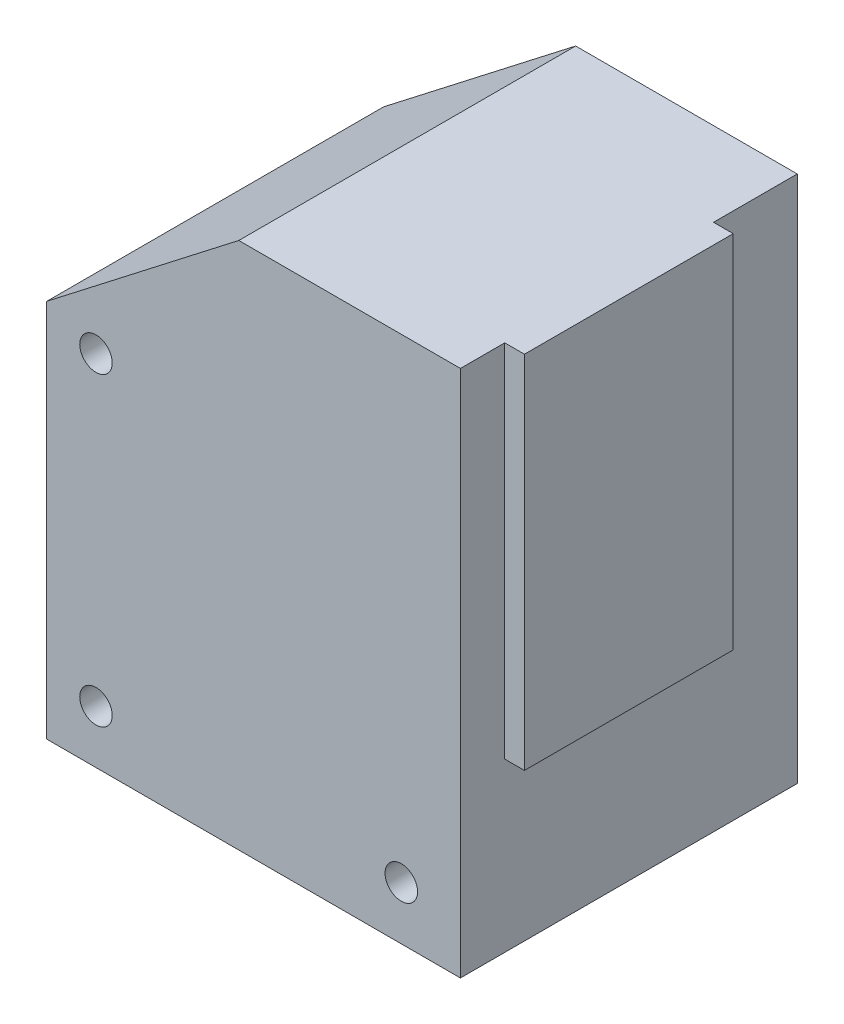
ISO-10303-21;
HEADER;
FILE_DESCRIPTION(('STEP AP214'),'2;1');
FILE_NAME('part.step','',(''),(''),'','','');
FILE_SCHEMA(('AUTOMOTIVE_DESIGN { 1 0 10303 214 1 1 1 1 }'));
ENDSEC;
DATA;
#1=APPLICATION_CONTEXT('core data for automotive mechanical design processes');
#2=APPLICATION_PROTOCOL_DEFINITION('international standard','automotive_design',2000,#1);
#3=PRODUCT_CONTEXT('',#1,'mechanical');
#4=PRODUCT('Part','Part','',(#3));
#5=PRODUCT_RELATED_PRODUCT_CATEGORY('part','',(#4));
#6=PRODUCT_DEFINITION_FORMATION('','',#4);
#7=PRODUCT_DEFINITION_CONTEXT('part definition',#1,'design');
#8=PRODUCT_DEFINITION('design','',#6,#7);
#9=PRODUCT_DEFINITION_SHAPE('','',#8);
#10=(LENGTH_UNIT() NAMED_UNIT(*) SI_UNIT(.MILLI.,.METRE.));
#11=(NAMED_UNIT(*) PLANE_ANGLE_UNIT() SI_UNIT($,.RADIAN.));
#12=(NAMED_UNIT(*) SI_UNIT($,.STERADIAN.) SOLID_ANGLE_UNIT());
#13=UNCERTAINTY_MEASURE_WITH_UNIT(LENGTH_MEASURE(1.E-05),#10,'distance_accuracy_value','');
#14=(GEOMETRIC_REPRESENTATION_CONTEXT(3) GLOBAL_UNCERTAINTY_ASSIGNED_CONTEXT((#13)) GLOBAL_UNIT_ASSIGNED_CONTEXT((#10,
#11,#12)) REPRESENTATION_CONTEXT('',''));
#15=CARTESIAN_POINT('',(0.,0.,0.));
#16=DIRECTION('',(0.,0.,1.));
#17=DIRECTION('',(1.,0.,0.));
#18=AXIS2_PLACEMENT_3D('',#15,#16,#17);
#19=CARTESIAN_POINT('',(42.,0.,34.2));
#20=DIRECTION('',(-1.,0.,0.));
#21=DIRECTION('',(0.,0.,1.));
#22=AXIS2_PLACEMENT_3D('',#19,#20,#21);
#23=PLANE('',#22);
#24=DIRECTION('',(0.,-1.,0.));
#25=VECTOR('',#24,1.);
#26=CARTESIAN_POINT('',(42.,53.6,29.7));
#27=LINE('',#26,#25);
#28=CARTESIAN_POINT('',(42.,53.6,29.7));
#29=VERTEX_POINT('',#28);
#30=CARTESIAN_POINT('',(42.,17.,29.7));
#31=VERTEX_POINT('',#30);
#32=EDGE_CURVE('E126',#29,#31,#27,.T.);
#33=ORIENTED_EDGE('',*,*,#32,.F.);
#34=DIRECTION('',(0.,0.,-1.));
#35=VECTOR('',#34,1.);
#36=CARTESIAN_POINT('',(42.,53.6,34.2));
#37=LINE('',#36,#35);
#38=CARTESIAN_POINT('',(42.,53.6,34.2));
#39=VERTEX_POINT('',#38);
#40=EDGE_CURVE('E166',#39,#29,#37,.T.);
#41=ORIENTED_EDGE('',*,*,#40,.F.);
#42=DIRECTION('',(0.,1.,0.));
#43=VECTOR('',#42,1.);
#44=CARTESIAN_POINT('',(42.,0.,34.2));
#45=LINE('',#44,#43);
#46=CARTESIAN_POINT('',(42.,0.,34.2));
#47=VERTEX_POINT('',#46);
#48=EDGE_CURVE('E145',#47,#39,#45,.T.);
#49=ORIENTED_EDGE('',*,*,#48,.F.);
#50=DIRECTION('',(0.,0.,-1.));
#51=VECTOR('',#50,1.);
#52=CARTESIAN_POINT('',(42.,0.,34.2));
#53=LINE('',#52,#51);
#54=CARTESIAN_POINT('',(42.,0.,0.));
#55=VERTEX_POINT('',#54);
#56=EDGE_CURVE('E42',#47,#55,#53,.T.);
#57=ORIENTED_EDGE('',*,*,#56,.T.);
#58=DIRECTION('',(0.,1.,0.));
#59=VECTOR('',#58,1.);
#60=CARTESIAN_POINT('',(42.,0.,0.));
#61=LINE('',#60,#59);
#62=CARTESIAN_POINT('',(42.,53.6,0.));
#63=VERTEX_POINT('',#62);
#64=EDGE_CURVE('E156',#55,#63,#61,.T.);
#65=ORIENTED_EDGE('',*,*,#64,.T.);
#66=CARTESIAN_POINT('',(42.,53.6,8.5));
#67=VERTEX_POINT('',#66);
#68=EDGE_CURVE('E55',#67,#63,#37,.T.);
#69=ORIENTED_EDGE('',*,*,#68,.F.);
#70=DIRECTION('',(0.,1.,0.));
#71=VECTOR('',#70,1.);
#72=CARTESIAN_POINT('',(42.,53.6,8.5));
#73=LINE('',#72,#71);
#74=CARTESIAN_POINT('',(42.,17.,8.5));
#75=VERTEX_POINT('',#74);
#76=EDGE_CURVE('E123',#75,#67,#73,.T.);
#77=ORIENTED_EDGE('',*,*,#76,.F.);
#78=DIRECTION('',(0.,0.,-1.));
#79=VECTOR('',#78,1.);
#80=CARTESIAN_POINT('',(42.,17.,29.7));
#81=LINE('',#80,#79);
#82=EDGE_CURVE('E49',#31,#75,#81,.T.);
#83=ORIENTED_EDGE('',*,*,#82,.F.);
#84=EDGE_LOOP('',(#33,#41,#49,#57,#65,#69,#77,#83));
#85=FACE_BOUND('',#84,.T.);
#86=ADVANCED_FACE('F34',(#85),#23,.F.);
#87=CARTESIAN_POINT('',(0.,0.,34.2));
#88=DIRECTION('',(1.,0.,0.));
#89=DIRECTION('',(0.,0.,-1.));
#90=AXIS2_PLACEMENT_3D('',#87,#88,#89);
#91=PLANE('',#90);
#92=DIRECTION('',(0.,-1.,0.));
#93=VECTOR('',#92,1.);
#94=CARTESIAN_POINT('',(0.,0.,0.));
#95=LINE('',#94,#93);
#96=CARTESIAN_POINT('',(0.,38.5,0.));
#97=VERTEX_POINT('',#96);
#98=CARTESIAN_POINT('',(0.,0.,0.));
#99=VERTEX_POINT('',#98);
#100=EDGE_CURVE('E137',#97,#99,#95,.T.);
#101=ORIENTED_EDGE('',*,*,#100,.T.);
#102=DIRECTION('',(0.,0.,-1.));
#103=VECTOR('',#102,1.);
#104=CARTESIAN_POINT('',(0.,0.,34.2));
#105=LINE('',#104,#103);
#106=CARTESIAN_POINT('',(0.,0.,34.2));
#107=VERTEX_POINT('',#106);
#108=EDGE_CURVE('E11',#107,#99,#105,.T.);
#109=ORIENTED_EDGE('',*,*,#108,.F.);
#110=DIRECTION('',(0.,-1.,0.));
#111=VECTOR('',#110,1.);
#112=CARTESIAN_POINT('',(0.,0.,34.2));
#113=LINE('',#112,#111);
#114=CARTESIAN_POINT('',(0.,38.5,34.2));
#115=VERTEX_POINT('',#114);
#116=EDGE_CURVE('E139',#115,#107,#113,.T.);
#117=ORIENTED_EDGE('',*,*,#116,.F.);
#118=DIRECTION('',(0.,0.,-1.));
#119=VECTOR('',#118,1.);
#120=CARTESIAN_POINT('',(0.,38.5,34.2));
#121=LINE('',#120,#119);
#122=EDGE_CURVE('E151',#115,#97,#121,.T.);
#123=ORIENTED_EDGE('',*,*,#122,.T.);
#124=EDGE_LOOP('',(#101,#109,#117,#123));
#125=FACE_BOUND('',#124,.T.);
#126=ADVANCED_FACE('F36',(#125),#91,.F.);
#127=CARTESIAN_POINT('',(0.,0.,34.2));
#128=DIRECTION('',(0.,1.,0.));
#129=DIRECTION('',(0.,0.,1.));
#130=AXIS2_PLACEMENT_3D('',#127,#128,#129);
#131=PLANE('',#130);
#132=CARTESIAN_POINT('',(26.,0.,23.7));
#133=DIRECTION('',(0.,-1.,0.));
#134=DIRECTION('',(0.,0.,-1.));
#135=AXIS2_PLACEMENT_3D('',#132,#133,#134);
#136=CIRCLE('',#135,8.);
#137=CARTESIAN_POINT('',(26.,0.,15.7));
#138=VERTEX_POINT('',#137);
#139=EDGE_CURVE('E127',#138,#138,#136,.T.);
#140=ORIENTED_EDGE('',*,*,#139,.F.);
#141=EDGE_LOOP('',(#140));
#142=FACE_BOUND('',#141,.T.);
#143=DIRECTION('',(1.,0.,0.));
#144=VECTOR('',#143,1.);
#145=CARTESIAN_POINT('',(0.,0.,0.));
#146=LINE('',#145,#144);
#147=EDGE_CURVE('E154',#99,#55,#146,.T.);
#148=ORIENTED_EDGE('',*,*,#147,.T.);
#149=ORIENTED_EDGE('',*,*,#56,.F.);
#150=DIRECTION('',(1.,0.,0.));
#151=VECTOR('',#150,1.);
#152=CARTESIAN_POINT('',(0.,0.,34.2));
#153=LINE('',#152,#151);
#154=EDGE_CURVE('E142',#107,#47,#153,.T.);
#155=ORIENTED_EDGE('',*,*,#154,.F.);
#156=ORIENTED_EDGE('',*,*,#108,.T.);
#157=EDGE_LOOP('',(#148,#149,#155,#156));
#158=FACE_BOUND('',#157,.T.);
#159=ADVANCED_FACE('F254',(#142,#158),#131,.F.);
#160=CARTESIAN_POINT('',(19.5,53.6,34.2));
#161=DIRECTION('',(0.,-1.,0.));
#162=DIRECTION('',(0.,0.,-1.));
#163=AXIS2_PLACEMENT_3D('',#160,#161,#162);
#164=PLANE('',#163);
#165=DIRECTION('',(-1.,0.,0.));
#166=VECTOR('',#165,1.);
#167=CARTESIAN_POINT('',(19.5,53.6,0.));
#168=LINE('',#167,#166);
#169=CARTESIAN_POINT('',(19.5,53.6,0.));
#170=VERTEX_POINT('',#169);
#171=EDGE_CURVE('E158',#63,#170,#168,.T.);
#172=ORIENTED_EDGE('',*,*,#171,.T.);
#173=DIRECTION('',(0.,0.,-1.));
#174=VECTOR('',#173,1.);
#175=CARTESIAN_POINT('',(19.5,53.6,34.2));
#176=LINE('',#175,#174);
#177=CARTESIAN_POINT('',(19.5,53.6,34.2));
#178=VERTEX_POINT('',#177);
#179=EDGE_CURVE('E163',#178,#170,#176,.T.);
#180=ORIENTED_EDGE('',*,*,#179,.F.);
#181=DIRECTION('',(-1.,0.,0.));
#182=VECTOR('',#181,1.);
#183=CARTESIAN_POINT('',(19.5,53.6,34.2));
#184=LINE('',#183,#182);
#185=EDGE_CURVE('E147',#39,#178,#184,.T.);
#186=ORIENTED_EDGE('',*,*,#185,.F.);
#187=ORIENTED_EDGE('',*,*,#40,.T.);
#188=DIRECTION('',(-1.,0.,0.));
#189=VECTOR('',#188,1.);
#190=CARTESIAN_POINT('',(44.,53.6,29.7));
#191=LINE('',#190,#189);
#192=CARTESIAN_POINT('',(44.,53.6,29.7));
#193=VERTEX_POINT('',#192);
#194=EDGE_CURVE('E192',#193,#29,#191,.T.);
#195=ORIENTED_EDGE('',*,*,#194,.F.);
#196=DIRECTION('',(0.,0.,1.));
#197=VECTOR('',#196,1.);
#198=CARTESIAN_POINT('',(44.,53.6,29.7));
#199=LINE('',#198,#197);
#200=CARTESIAN_POINT('',(44.,53.6,8.5));
#201=VERTEX_POINT('',#200);
#202=EDGE_CURVE('E119',#201,#193,#199,.T.);
#203=ORIENTED_EDGE('',*,*,#202,.F.);
#204=DIRECTION('',(-1.,0.,0.));
#205=VECTOR('',#204,1.);
#206=CARTESIAN_POINT('',(44.,53.6,8.5));
#207=LINE('',#206,#205);
#208=EDGE_CURVE('E132',#201,#67,#207,.T.);
#209=ORIENTED_EDGE('',*,*,#208,.T.);
#210=ORIENTED_EDGE('',*,*,#68,.T.);
#211=EDGE_LOOP('',(#172,#180,#186,#187,#195,#203,#209,#210));
#212=FACE_BOUND('',#211,.T.);
#213=ADVANCED_FACE('F181',(#212),#164,.F.);
#214=CARTESIAN_POINT('',(0.,38.5,34.2));
#215=DIRECTION('',(0.612254968981374,-0.79066039040641,0.));
#216=DIRECTION('',(0.79066039040641,0.612254968981374,0.));
#217=AXIS2_PLACEMENT_3D('',#214,#215,#216);
#218=PLANE('',#217);
#219=DIRECTION('',(-0.79066039040641,-0.612254968981374,0.));
#220=VECTOR('',#219,1.);
#221=CARTESIAN_POINT('',(0.,38.5,0.));
#222=LINE('',#221,#220);
#223=EDGE_CURVE('E143',#170,#97,#222,.T.);
#224=ORIENTED_EDGE('',*,*,#223,.T.);
#225=ORIENTED_EDGE('',*,*,#122,.F.);
#226=DIRECTION('',(-0.79066039040641,-0.612254968981374,0.));
#227=VECTOR('',#226,1.);
#228=CARTESIAN_POINT('',(0.,38.5,34.2));
#229=LINE('',#228,#227);
#230=EDGE_CURVE('E149',#178,#115,#229,.T.);
#231=ORIENTED_EDGE('',*,*,#230,.F.);
#232=ORIENTED_EDGE('',*,*,#179,.T.);
#233=EDGE_LOOP('',(#224,#225,#231,#232));
#234=FACE_BOUND('',#233,.T.);
#235=ADVANCED_FACE('F186',(#234),#218,.F.);
#236=CARTESIAN_POINT('',(0.,0.,34.2));
#237=DIRECTION('',(0.,0.,-1.));
#238=DIRECTION('',(-1.,0.,0.));
#239=AXIS2_PLACEMENT_3D('',#236,#237,#238);
#240=PLANE('',#239);
#241=CARTESIAN_POINT('',(36.,5.4,34.2));
#242=DIRECTION('',(0.,0.,-1.));
#243=DIRECTION('',(-1.,0.,0.));
#244=AXIS2_PLACEMENT_3D('',#241,#242,#243);
#245=CIRCLE('',#244,1.65);
#246=CARTESIAN_POINT('',(34.35,5.4,34.2));
#247=VERTEX_POINT('',#246);
#248=EDGE_CURVE('E198',#247,#247,#245,.T.);
#249=ORIENTED_EDGE('',*,*,#248,.T.);
#250=EDGE_LOOP('',(#249));
#251=FACE_BOUND('',#250,.T.);
#252=CARTESIAN_POINT('',(5.,5.4,34.2));
#253=DIRECTION('',(0.,0.,-1.));
#254=DIRECTION('',(-1.,0.,0.));
#255=AXIS2_PLACEMENT_3D('',#252,#253,#254);
#256=CIRCLE('',#255,1.65);
#257=CARTESIAN_POINT('',(3.35,5.4,34.2));
#258=VERTEX_POINT('',#257);
#259=EDGE_CURVE('E210',#258,#258,#256,.T.);
#260=ORIENTED_EDGE('',*,*,#259,.T.);
#261=EDGE_LOOP('',(#260));
#262=FACE_BOUND('',#261,.T.);
#263=CARTESIAN_POINT('',(5.,36.4,34.2));
#264=DIRECTION('',(0.,0.,-1.));
#265=DIRECTION('',(-1.,0.,0.));
#266=AXIS2_PLACEMENT_3D('',#263,#264,#265);
#267=CIRCLE('',#266,1.65);
#268=CARTESIAN_POINT('',(3.35,36.4,34.2));
#269=VERTEX_POINT('',#268);
#270=EDGE_CURVE('E204',#269,#269,#267,.T.);
#271=ORIENTED_EDGE('',*,*,#270,.T.);
#272=EDGE_LOOP('',(#271));
#273=FACE_BOUND('',#272,.T.);
#274=ORIENTED_EDGE('',*,*,#116,.T.);
#275=ORIENTED_EDGE('',*,*,#154,.T.);
#276=ORIENTED_EDGE('',*,*,#48,.T.);
#277=ORIENTED_EDGE('',*,*,#185,.T.);
#278=ORIENTED_EDGE('',*,*,#230,.T.);
#279=EDGE_LOOP('',(#274,#275,#276,#277,#278));
#280=FACE_BOUND('',#279,.T.);
#281=ADVANCED_FACE('F190',(#251,#262,#273,#280),#240,.F.);
#282=CARTESIAN_POINT('',(0.,0.,0.));
#283=DIRECTION('',(0.,0.,-1.));
#284=DIRECTION('',(-1.,0.,0.));
#285=AXIS2_PLACEMENT_3D('',#282,#283,#284);
#286=PLANE('',#285);
#287=CARTESIAN_POINT('',(36.,5.4,0.));
#288=DIRECTION('',(0.,0.,-1.));
#289=DIRECTION('',(-1.,0.,0.));
#290=AXIS2_PLACEMENT_3D('',#287,#288,#289);
#291=CIRCLE('',#290,1.65);
#292=CARTESIAN_POINT('',(34.35,5.4,0.));
#293=VERTEX_POINT('',#292);
#294=EDGE_CURVE('E213',#293,#293,#291,.T.);
#295=ORIENTED_EDGE('',*,*,#294,.F.);
#296=EDGE_LOOP('',(#295));
#297=FACE_BOUND('',#296,.T.);
#298=CARTESIAN_POINT('',(5.,5.4,0.));
#299=DIRECTION('',(0.,0.,-1.));
#300=DIRECTION('',(-1.,0.,0.));
#301=AXIS2_PLACEMENT_3D('',#298,#299,#300);
#302=CIRCLE('',#301,1.65);
#303=CARTESIAN_POINT('',(3.35,5.4,0.));
#304=VERTEX_POINT('',#303);
#305=EDGE_CURVE('E207',#304,#304,#302,.T.);
#306=ORIENTED_EDGE('',*,*,#305,.F.);
#307=EDGE_LOOP('',(#306));
#308=FACE_BOUND('',#307,.T.);
#309=CARTESIAN_POINT('',(5.,36.4,0.));
#310=DIRECTION('',(0.,0.,-1.));
#311=DIRECTION('',(-1.,0.,0.));
#312=AXIS2_PLACEMENT_3D('',#309,#310,#311);
#313=CIRCLE('',#312,1.65);
#314=CARTESIAN_POINT('',(3.35,36.4,0.));
#315=VERTEX_POINT('',#314);
#316=EDGE_CURVE('E201',#315,#315,#313,.T.);
#317=ORIENTED_EDGE('',*,*,#316,.F.);
#318=EDGE_LOOP('',(#317));
#319=FACE_BOUND('',#318,.T.);
#320=ORIENTED_EDGE('',*,*,#100,.F.);
#321=ORIENTED_EDGE('',*,*,#223,.F.);
#322=ORIENTED_EDGE('',*,*,#171,.F.);
#323=ORIENTED_EDGE('',*,*,#64,.F.);
#324=ORIENTED_EDGE('',*,*,#147,.F.);
#325=EDGE_LOOP('',(#320,#321,#322,#323,#324));
#326=FACE_BOUND('',#325,.T.);
#327=ADVANCED_FACE('F177',(#297,#308,#319,#326),#286,.T.);
#328=CARTESIAN_POINT('',(26.,10.,23.7));
#329=DIRECTION('',(0.,-1.,0.));
#330=DIRECTION('',(0.,0.,-1.));
#331=AXIS2_PLACEMENT_3D('',#328,#329,#330);
#332=CYLINDRICAL_SURFACE('',#331,8.);
#333=CARTESIAN_POINT('',(26.,10.,23.7));
#334=DIRECTION('',(0.,-1.,0.));
#335=DIRECTION('',(0.,0.,-1.));
#336=AXIS2_PLACEMENT_3D('',#333,#334,#335);
#337=CIRCLE('',#336,8.);
#338=CARTESIAN_POINT('',(26.,10.,15.7));
#339=VERTEX_POINT('',#338);
#340=EDGE_CURVE('E130',#339,#339,#337,.T.);
#341=ORIENTED_EDGE('',*,*,#340,.F.);
#342=EDGE_LOOP('',(#341));
#343=FACE_BOUND('',#342,.T.);
#344=ORIENTED_EDGE('',*,*,#139,.T.);
#345=EDGE_LOOP('',(#344));
#346=FACE_BOUND('',#345,.T.);
#347=ADVANCED_FACE('F230',(#343,#346),#332,.F.);
#348=CARTESIAN_POINT('',(26.,10.,23.7));
#349=DIRECTION('',(0.,-1.,0.));
#350=DIRECTION('',(0.,0.,-1.));
#351=AXIS2_PLACEMENT_3D('',#348,#349,#350);
#352=PLANE('',#351);
#353=ORIENTED_EDGE('',*,*,#340,.T.);
#354=EDGE_LOOP('',(#353));
#355=FACE_BOUND('',#354,.T.);
#356=ADVANCED_FACE('F266',(#355),#352,.T.);
#357=CARTESIAN_POINT('',(44.,53.6,29.7));
#358=DIRECTION('',(0.,0.,-1.));
#359=DIRECTION('',(0.,1.,0.));
#360=AXIS2_PLACEMENT_3D('',#357,#358,#359);
#361=PLANE('',#360);
#362=ORIENTED_EDGE('',*,*,#32,.T.);
#363=DIRECTION('',(-1.,0.,0.));
#364=VECTOR('',#363,1.);
#365=CARTESIAN_POINT('',(44.,17.,29.7));
#366=LINE('',#365,#364);
#367=CARTESIAN_POINT('',(44.,17.,29.7));
#368=VERTEX_POINT('',#367);
#369=EDGE_CURVE('E107',#368,#31,#366,.T.);
#370=ORIENTED_EDGE('',*,*,#369,.F.);
#371=DIRECTION('',(0.,-1.,0.));
#372=VECTOR('',#371,1.);
#373=CARTESIAN_POINT('',(44.,53.6,29.7));
#374=LINE('',#373,#372);
#375=EDGE_CURVE('E114',#193,#368,#374,.T.);
#376=ORIENTED_EDGE('',*,*,#375,.F.);
#377=ORIENTED_EDGE('',*,*,#194,.T.);
#378=EDGE_LOOP('',(#362,#370,#376,#377));
#379=FACE_BOUND('',#378,.T.);
#380=ADVANCED_FACE('F125',(#379),#361,.F.);
#381=CARTESIAN_POINT('',(44.,17.,29.7));
#382=DIRECTION('',(0.,1.,0.));
#383=DIRECTION('',(0.,0.,1.));
#384=AXIS2_PLACEMENT_3D('',#381,#382,#383);
#385=PLANE('',#384);
#386=ORIENTED_EDGE('',*,*,#82,.T.);
#387=DIRECTION('',(-1.,0.,0.));
#388=VECTOR('',#387,1.);
#389=CARTESIAN_POINT('',(44.,17.,8.5));
#390=LINE('',#389,#388);
#391=CARTESIAN_POINT('',(44.,17.,8.5));
#392=VERTEX_POINT('',#391);
#393=EDGE_CURVE('E110',#392,#75,#390,.T.);
#394=ORIENTED_EDGE('',*,*,#393,.F.);
#395=DIRECTION('',(0.,0.,-1.));
#396=VECTOR('',#395,1.);
#397=CARTESIAN_POINT('',(44.,17.,29.7));
#398=LINE('',#397,#396);
#399=EDGE_CURVE('E103',#368,#392,#398,.T.);
#400=ORIENTED_EDGE('',*,*,#399,.F.);
#401=ORIENTED_EDGE('',*,*,#369,.T.);
#402=EDGE_LOOP('',(#386,#394,#400,#401));
#403=FACE_BOUND('',#402,.T.);
#404=ADVANCED_FACE('F105',(#403),#385,.F.);
#405=CARTESIAN_POINT('',(44.,53.6,8.5));
#406=DIRECTION('',(0.,0.,1.));
#407=DIRECTION('',(0.,-1.,0.));
#408=AXIS2_PLACEMENT_3D('',#405,#406,#407);
#409=PLANE('',#408);
#410=ORIENTED_EDGE('',*,*,#76,.T.);
#411=ORIENTED_EDGE('',*,*,#208,.F.);
#412=DIRECTION('',(0.,1.,0.));
#413=VECTOR('',#412,1.);
#414=CARTESIAN_POINT('',(44.,53.6,8.5));
#415=LINE('',#414,#413);
#416=EDGE_CURVE('E113',#392,#201,#415,.T.);
#417=ORIENTED_EDGE('',*,*,#416,.F.);
#418=ORIENTED_EDGE('',*,*,#393,.T.);
#419=EDGE_LOOP('',(#410,#411,#417,#418));
#420=FACE_BOUND('',#419,.T.);
#421=ADVANCED_FACE('F246',(#420),#409,.F.);
#422=CARTESIAN_POINT('',(44.,0.,0.));
#423=DIRECTION('',(1.,0.,0.));
#424=DIRECTION('',(0.,0.,-1.));
#425=AXIS2_PLACEMENT_3D('',#422,#423,#424);
#426=PLANE('',#425);
#427=ORIENTED_EDGE('',*,*,#375,.T.);
#428=ORIENTED_EDGE('',*,*,#399,.T.);
#429=ORIENTED_EDGE('',*,*,#416,.T.);
#430=ORIENTED_EDGE('',*,*,#202,.T.);
#431=EDGE_LOOP('',(#427,#428,#429,#430));
#432=FACE_BOUND('',#431,.T.);
#433=ADVANCED_FACE('F117',(#432),#426,.T.);
#434=CARTESIAN_POINT('',(5.,36.4,34.2));
#435=DIRECTION('',(0.,0.,-1.));
#436=DIRECTION('',(-1.,0.,0.));
#437=AXIS2_PLACEMENT_3D('',#434,#435,#436);
#438=CYLINDRICAL_SURFACE('',#437,1.65);
#439=ORIENTED_EDGE('',*,*,#270,.F.);
#440=EDGE_LOOP('',(#439));
#441=FACE_BOUND('',#440,.T.);
#442=ORIENTED_EDGE('',*,*,#316,.T.);
#443=EDGE_LOOP('',(#442));
#444=FACE_BOUND('',#443,.T.);
#445=ADVANCED_FACE('F236',(#441,#444),#438,.F.);
#446=CARTESIAN_POINT('',(5.,5.4,34.2));
#447=DIRECTION('',(0.,0.,-1.));
#448=DIRECTION('',(-1.,0.,0.));
#449=AXIS2_PLACEMENT_3D('',#446,#447,#448);
#450=CYLINDRICAL_SURFACE('',#449,1.65);
#451=ORIENTED_EDGE('',*,*,#259,.F.);
#452=EDGE_LOOP('',(#451));
#453=FACE_BOUND('',#452,.T.);
#454=ORIENTED_EDGE('',*,*,#305,.T.);
#455=EDGE_LOOP('',(#454));
#456=FACE_BOUND('',#455,.T.);
#457=ADVANCED_FACE('F224',(#453,#456),#450,.F.);
#458=CARTESIAN_POINT('',(36.,5.4,34.2));
#459=DIRECTION('',(0.,0.,-1.));
#460=DIRECTION('',(-1.,0.,0.));
#461=AXIS2_PLACEMENT_3D('',#458,#459,#460);
#462=CYLINDRICAL_SURFACE('',#461,1.65);
#463=ORIENTED_EDGE('',*,*,#248,.F.);
#464=EDGE_LOOP('',(#463));
#465=FACE_BOUND('',#464,.T.);
#466=ORIENTED_EDGE('',*,*,#294,.T.);
#467=EDGE_LOOP('',(#466));
#468=FACE_BOUND('',#467,.T.);
#469=ADVANCED_FACE('F221',(#465,#468),#462,.F.);
#470=CLOSED_SHELL('',(#86,#126,#159,#213,#235,#281,#327,#347,#356,#380,#404,#421,#433,#445,#457,#469));
#471=MANIFOLD_SOLID_BREP('B2',#470);
#472=ADVANCED_BREP_SHAPE_REPRESENTATION('',(#18,#471),#14);
#473=SHAPE_DEFINITION_REPRESENTATION(#9,#472);
ENDSEC;
END-ISO-10303-21;
